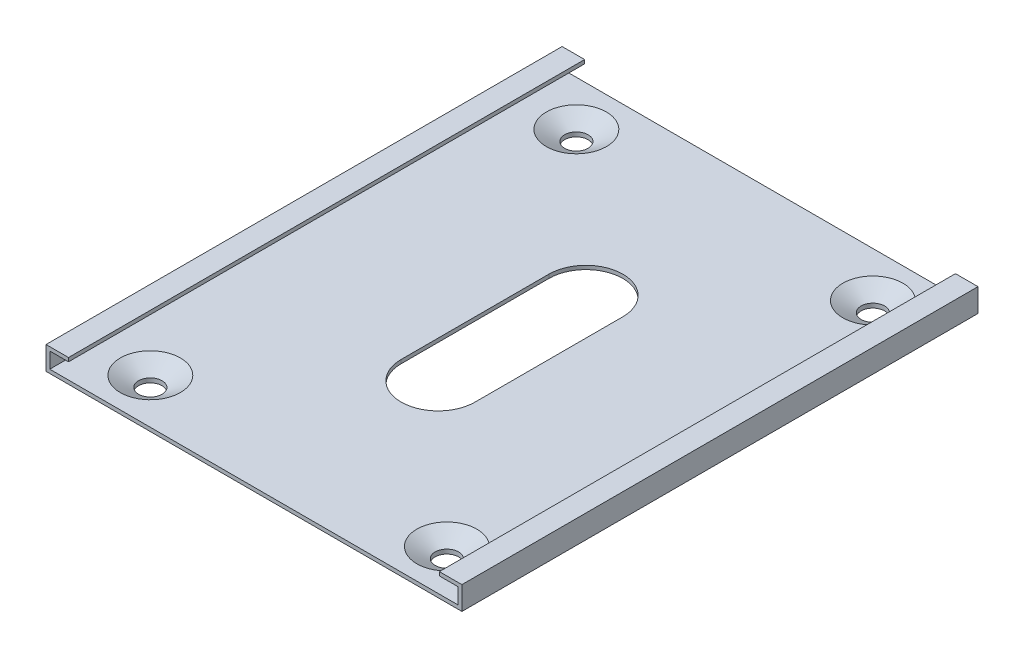
ISO-10303-21;
HEADER;
FILE_DESCRIPTION(('STEP AP214'),'2;1');
FILE_NAME('part.step','',(''),(''),'','','');
FILE_SCHEMA(('AUTOMOTIVE_DESIGN { 1 0 10303 214 1 1 1 1 }'));
ENDSEC;
DATA;
#1=APPLICATION_CONTEXT('core data for automotive mechanical design processes');
#2=APPLICATION_PROTOCOL_DEFINITION('international standard','automotive_design',2000,#1);
#3=PRODUCT_CONTEXT('',#1,'mechanical');
#4=PRODUCT('Part','Part','',(#3));
#5=PRODUCT_RELATED_PRODUCT_CATEGORY('part','',(#4));
#6=PRODUCT_DEFINITION_FORMATION('','',#4);
#7=PRODUCT_DEFINITION_CONTEXT('part definition',#1,'design');
#8=PRODUCT_DEFINITION('design','',#6,#7);
#9=PRODUCT_DEFINITION_SHAPE('','',#8);
#10=(LENGTH_UNIT() NAMED_UNIT(*) SI_UNIT(.MILLI.,.METRE.));
#11=(NAMED_UNIT(*) PLANE_ANGLE_UNIT() SI_UNIT($,.RADIAN.));
#12=(NAMED_UNIT(*) SI_UNIT($,.STERADIAN.) SOLID_ANGLE_UNIT());
#13=UNCERTAINTY_MEASURE_WITH_UNIT(LENGTH_MEASURE(1.E-05),#10,'distance_accuracy_value','');
#14=(GEOMETRIC_REPRESENTATION_CONTEXT(3) GLOBAL_UNCERTAINTY_ASSIGNED_CONTEXT((#13)) GLOBAL_UNIT_ASSIGNED_CONTEXT((#10,
#11,#12)) REPRESENTATION_CONTEXT('',''));
#15=CARTESIAN_POINT('',(0.,0.,0.));
#16=DIRECTION('',(0.,0.,1.));
#17=DIRECTION('',(1.,0.,0.));
#18=AXIS2_PLACEMENT_3D('',#15,#16,#17);
#19=CARTESIAN_POINT('',(-27.6352,2.13359999999999,69.85));
#20=DIRECTION('',(0.,1.,0.));
#21=DIRECTION('',(0.,0.,1.));
#22=AXIS2_PLACEMENT_3D('',#19,#20,#21);
#23=PLANE('',#22);
#24=DIRECTION('',(1.,0.,0.));
#25=VECTOR('',#24,1.);
#26=CARTESIAN_POINT('',(-27.6352,2.13359999999999,0.));
#27=LINE('',#26,#25);
#28=CARTESIAN_POINT('',(-27.6352,2.13359999999999,0.));
#29=VERTEX_POINT('',#28);
#30=CARTESIAN_POINT('',(-25.0952,2.13359999999999,0.));
#31=VERTEX_POINT('',#30);
#32=EDGE_CURVE('E171',#29,#31,#27,.T.);
#33=ORIENTED_EDGE('',*,*,#32,.T.);
#34=DIRECTION('',(0.,0.,-1.));
#35=VECTOR('',#34,1.);
#36=CARTESIAN_POINT('',(-25.0952,2.13359999999999,69.85));
#37=LINE('',#36,#35);
#38=CARTESIAN_POINT('',(-25.0952,2.13359999999999,69.85));
#39=VERTEX_POINT('',#38);
#40=EDGE_CURVE('E228',#39,#31,#37,.T.);
#41=ORIENTED_EDGE('',*,*,#40,.F.);
#42=DIRECTION('',(1.,0.,0.));
#43=VECTOR('',#42,1.);
#44=CARTESIAN_POINT('',(-27.6352,2.13359999999999,69.85));
#45=LINE('',#44,#43);
#46=CARTESIAN_POINT('',(-27.6352,2.13359999999999,69.85));
#47=VERTEX_POINT('',#46);
#48=EDGE_CURVE('E166',#47,#39,#45,.T.);
#49=ORIENTED_EDGE('',*,*,#48,.F.);
#50=DIRECTION('',(0.,0.,-1.));
#51=VECTOR('',#50,1.);
#52=CARTESIAN_POINT('',(-27.6352,2.13359999999999,69.85));
#53=LINE('',#52,#51);
#54=EDGE_CURVE('E161',#47,#29,#53,.T.);
#55=ORIENTED_EDGE('',*,*,#54,.T.);
#56=EDGE_LOOP('',(#33,#41,#49,#55));
#57=FACE_BOUND('',#56,.T.);
#58=ADVANCED_FACE('F32',(#57),#23,.F.);
#59=CARTESIAN_POINT('',(-25.0952,2.64159999999999,69.85));
#60=DIRECTION('',(1.,0.,0.));
#61=DIRECTION('',(0.,0.,-1.));
#62=AXIS2_PLACEMENT_3D('',#59,#60,#61);
#63=PLANE('',#62);
#64=DIRECTION('',(0.,-1.,0.));
#65=VECTOR('',#64,1.);
#66=CARTESIAN_POINT('',(-25.0952,2.64159999999999,0.));
#67=LINE('',#66,#65);
#68=CARTESIAN_POINT('',(-25.0952,2.64159999999999,0.));
#69=VERTEX_POINT('',#68);
#70=EDGE_CURVE('E178',#69,#31,#67,.T.);
#71=ORIENTED_EDGE('',*,*,#70,.F.);
#72=DIRECTION('',(0.,0.,-1.));
#73=VECTOR('',#72,1.);
#74=CARTESIAN_POINT('',(-25.0952,2.64159999999999,69.85));
#75=LINE('',#74,#73);
#76=CARTESIAN_POINT('',(-25.0952,2.64159999999999,69.85));
#77=VERTEX_POINT('',#76);
#78=EDGE_CURVE('E226',#77,#69,#75,.T.);
#79=ORIENTED_EDGE('',*,*,#78,.F.);
#80=DIRECTION('',(0.,-1.,0.));
#81=VECTOR('',#80,1.);
#82=CARTESIAN_POINT('',(-25.0952,2.64159999999999,69.85));
#83=LINE('',#82,#81);
#84=EDGE_CURVE('E289',#77,#39,#83,.T.);
#85=ORIENTED_EDGE('',*,*,#84,.T.);
#86=ORIENTED_EDGE('',*,*,#40,.T.);
#87=EDGE_LOOP('',(#71,#79,#85,#86));
#88=FACE_BOUND('',#87,.T.);
#89=ADVANCED_FACE('F320',(#88),#63,.T.);
#90=CARTESIAN_POINT('',(-27.6352,2.64159999999999,69.85));
#91=DIRECTION('',(0.,1.,0.));
#92=DIRECTION('',(0.,0.,1.));
#93=AXIS2_PLACEMENT_3D('',#90,#91,#92);
#94=PLANE('',#93);
#95=DIRECTION('',(1.,0.,0.));
#96=VECTOR('',#95,1.);
#97=CARTESIAN_POINT('',(-27.6352,2.64159999999999,0.));
#98=LINE('',#97,#96);
#99=CARTESIAN_POINT('',(-28.1432,2.64159999999999,0.));
#100=VERTEX_POINT('',#99);
#101=EDGE_CURVE('E181',#100,#69,#98,.T.);
#102=ORIENTED_EDGE('',*,*,#101,.F.);
#103=DIRECTION('',(0.,0.,-1.));
#104=VECTOR('',#103,1.);
#105=CARTESIAN_POINT('',(-28.1432,2.64159999999999,69.85));
#106=LINE('',#105,#104);
#107=CARTESIAN_POINT('',(-28.1432,2.64159999999999,69.85));
#108=VERTEX_POINT('',#107);
#109=EDGE_CURVE('E224',#108,#100,#106,.T.);
#110=ORIENTED_EDGE('',*,*,#109,.F.);
#111=DIRECTION('',(1.,0.,0.));
#112=VECTOR('',#111,1.);
#113=CARTESIAN_POINT('',(-27.6352,2.64159999999999,69.85));
#114=LINE('',#113,#112);
#115=EDGE_CURVE('E292',#108,#77,#114,.T.);
#116=ORIENTED_EDGE('',*,*,#115,.T.);
#117=ORIENTED_EDGE('',*,*,#78,.T.);
#118=EDGE_LOOP('',(#102,#110,#116,#117));
#119=FACE_BOUND('',#118,.T.);
#120=ADVANCED_FACE('F323',(#119),#94,.T.);
#121=CARTESIAN_POINT('',(-28.1432,0.,69.85));
#122=DIRECTION('',(-1.,0.,0.));
#123=DIRECTION('',(0.,0.,1.));
#124=AXIS2_PLACEMENT_3D('',#121,#122,#123);
#125=PLANE('',#124);
#126=DIRECTION('',(0.,1.,0.));
#127=VECTOR('',#126,1.);
#128=CARTESIAN_POINT('',(-28.1432,0.,0.));
#129=LINE('',#128,#127);
#130=CARTESIAN_POINT('',(-28.1432,-0.508,0.));
#131=VERTEX_POINT('',#130);
#132=EDGE_CURVE('E188',#131,#100,#129,.T.);
#133=ORIENTED_EDGE('',*,*,#132,.F.);
#134=DIRECTION('',(0.,0.,-1.));
#135=VECTOR('',#134,1.);
#136=CARTESIAN_POINT('',(-28.1432,-0.508,69.85));
#137=LINE('',#136,#135);
#138=CARTESIAN_POINT('',(-28.1432,-0.508,69.85));
#139=VERTEX_POINT('',#138);
#140=EDGE_CURVE('E222',#139,#131,#137,.T.);
#141=ORIENTED_EDGE('',*,*,#140,.F.);
#142=DIRECTION('',(0.,1.,0.));
#143=VECTOR('',#142,1.);
#144=CARTESIAN_POINT('',(-28.1432,0.,69.85));
#145=LINE('',#144,#143);
#146=EDGE_CURVE('E295',#139,#108,#145,.T.);
#147=ORIENTED_EDGE('',*,*,#146,.T.);
#148=ORIENTED_EDGE('',*,*,#109,.T.);
#149=EDGE_LOOP('',(#133,#141,#147,#148));
#150=FACE_BOUND('',#149,.T.);
#151=ADVANCED_FACE('F328',(#150),#125,.T.);
#152=CARTESIAN_POINT('',(27.6352,-0.508,69.85));
#153=DIRECTION('',(0.,-1.,0.));
#154=DIRECTION('',(0.,0.,-1.));
#155=AXIS2_PLACEMENT_3D('',#152,#153,#154);
#156=PLANE('',#155);
#157=CARTESIAN_POINT('',(-20.1168,-0.508,6.096));
#158=DIRECTION('',(0.,-1.,0.));
#159=DIRECTION('',(0.,0.,-1.));
#160=AXIS2_PLACEMENT_3D('',#157,#158,#159);
#161=CIRCLE('',#160,4.20011818975501);
#162=CARTESIAN_POINT('',(-20.1168,-0.508,1.895881810245));
#163=VERTEX_POINT('',#162);
#164=EDGE_CURVE('E528',#163,#163,#161,.F.);
#165=ORIENTED_EDGE('',*,*,#164,.T.);
#166=EDGE_LOOP('',(#165));
#167=FACE_BOUND('',#166,.T.);
#168=CARTESIAN_POINT('',(20.0152,-0.508,6.096));
#169=DIRECTION('',(0.,-1.,0.));
#170=DIRECTION('',(0.,0.,-1.));
#171=AXIS2_PLACEMENT_3D('',#168,#169,#170);
#172=CIRCLE('',#171,4.20011818975501);
#173=CARTESIAN_POINT('',(20.0152,-0.508,1.895881810245));
#174=VERTEX_POINT('',#173);
#175=EDGE_CURVE('E245',#174,#174,#172,.F.);
#176=ORIENTED_EDGE('',*,*,#175,.T.);
#177=EDGE_LOOP('',(#176));
#178=FACE_BOUND('',#177,.T.);
#179=CARTESIAN_POINT('',(-20.1168,-0.508,63.754));
#180=DIRECTION('',(0.,-1.,0.));
#181=DIRECTION('',(0.,0.,-1.));
#182=AXIS2_PLACEMENT_3D('',#179,#180,#181);
#183=CIRCLE('',#182,4.20011818975501);
#184=CARTESIAN_POINT('',(-20.1168,-0.508,59.553881810245));
#185=VERTEX_POINT('',#184);
#186=EDGE_CURVE('E268',#185,#185,#183,.F.);
#187=ORIENTED_EDGE('',*,*,#186,.T.);
#188=EDGE_LOOP('',(#187));
#189=FACE_BOUND('',#188,.T.);
#190=CARTESIAN_POINT('',(20.0152,-0.508,63.754));
#191=DIRECTION('',(0.,-1.,0.));
#192=DIRECTION('',(0.,0.,-1.));
#193=AXIS2_PLACEMENT_3D('',#190,#191,#192);
#194=CIRCLE('',#193,4.20011818975501);
#195=CARTESIAN_POINT('',(20.0152,-0.508,59.553881810245));
#196=VERTEX_POINT('',#195);
#197=EDGE_CURVE('E280',#196,#196,#194,.F.);
#198=ORIENTED_EDGE('',*,*,#197,.T.);
#199=EDGE_LOOP('',(#198));
#200=FACE_BOUND('',#199,.T.);
#201=CARTESIAN_POINT('',(0.,-0.508,44.925));
#202=DIRECTION('',(0.,-1.,0.));
#203=DIRECTION('',(0.,0.,-1.));
#204=AXIS2_PLACEMENT_3D('',#201,#202,#203);
#205=CIRCLE('',#204,5.);
#206=CARTESIAN_POINT('',(4.99999999999999,-0.508,44.925));
#207=VERTEX_POINT('',#206);
#208=CARTESIAN_POINT('',(-5.00000000000001,-0.508,44.925));
#209=VERTEX_POINT('',#208);
#210=EDGE_CURVE('E179',#207,#209,#205,.T.);
#211=ORIENTED_EDGE('',*,*,#210,.F.);
#212=DIRECTION('',(0.,0.,-1.));
#213=VECTOR('',#212,1.);
#214=CARTESIAN_POINT('',(4.99999999999999,-0.508,44.925));
#215=LINE('',#214,#213);
#216=CARTESIAN_POINT('',(5.00000000000002,-0.508,24.925));
#217=VERTEX_POINT('',#216);
#218=EDGE_CURVE('E77',#217,#207,#215,.F.);
#219=ORIENTED_EDGE('',*,*,#218,.F.);
#220=CARTESIAN_POINT('',(0.,-0.508,24.925));
#221=DIRECTION('',(0.,-1.,0.));
#222=DIRECTION('',(0.,0.,-1.));
#223=AXIS2_PLACEMENT_3D('',#220,#221,#222);
#224=CIRCLE('',#223,5.);
#225=CARTESIAN_POINT('',(-4.99999999999999,-0.508,24.925));
#226=VERTEX_POINT('',#225);
#227=EDGE_CURVE('E240',#226,#217,#224,.T.);
#228=ORIENTED_EDGE('',*,*,#227,.F.);
#229=DIRECTION('',(0.,0.,1.));
#230=VECTOR('',#229,1.);
#231=CARTESIAN_POINT('',(-5.00000000000001,-0.508,44.925));
#232=LINE('',#231,#230);
#233=EDGE_CURVE('E238',#209,#226,#232,.F.);
#234=ORIENTED_EDGE('',*,*,#233,.F.);
#235=EDGE_LOOP('',(#211,#219,#228,#234));
#236=FACE_BOUND('',#235,.T.);
#237=DIRECTION('',(1.,0.,0.));
#238=VECTOR('',#237,1.);
#239=CARTESIAN_POINT('',(27.6352,-0.508,0.));
#240=LINE('',#239,#238);
#241=CARTESIAN_POINT('',(28.1432,-0.508,0.));
#242=VERTEX_POINT('',#241);
#243=EDGE_CURVE('E191',#242,#131,#240,.F.);
#244=ORIENTED_EDGE('',*,*,#243,.F.);
#245=DIRECTION('',(0.,0.,-1.));
#246=VECTOR('',#245,1.);
#247=CARTESIAN_POINT('',(28.1432,-0.508,69.85));
#248=LINE('',#247,#246);
#249=CARTESIAN_POINT('',(28.1432,-0.508,69.85));
#250=VERTEX_POINT('',#249);
#251=EDGE_CURVE('E220',#250,#242,#248,.T.);
#252=ORIENTED_EDGE('',*,*,#251,.F.);
#253=DIRECTION('',(1.,0.,0.));
#254=VECTOR('',#253,1.);
#255=CARTESIAN_POINT('',(27.6352,-0.508,69.85));
#256=LINE('',#255,#254);
#257=EDGE_CURVE('E298',#250,#139,#256,.F.);
#258=ORIENTED_EDGE('',*,*,#257,.T.);
#259=ORIENTED_EDGE('',*,*,#140,.T.);
#260=EDGE_LOOP('',(#244,#252,#258,#259));
#261=FACE_BOUND('',#260,.T.);
#262=ADVANCED_FACE('F331',(#167,#178,#189,#200,#236,#261),#156,.T.);
#263=CARTESIAN_POINT('',(28.1432,0.,69.85));
#264=DIRECTION('',(1.,0.,0.));
#265=DIRECTION('',(0.,0.,-1.));
#266=AXIS2_PLACEMENT_3D('',#263,#264,#265);
#267=PLANE('',#266);
#268=DIRECTION('',(0.,1.,0.));
#269=VECTOR('',#268,1.);
#270=CARTESIAN_POINT('',(28.1432,0.,0.));
#271=LINE('',#270,#269);
#272=CARTESIAN_POINT('',(28.1432,2.64159999999999,0.));
#273=VERTEX_POINT('',#272);
#274=EDGE_CURVE('E194',#273,#242,#271,.F.);
#275=ORIENTED_EDGE('',*,*,#274,.F.);
#276=DIRECTION('',(0.,0.,-1.));
#277=VECTOR('',#276,1.);
#278=CARTESIAN_POINT('',(28.1432,2.64159999999999,69.85));
#279=LINE('',#278,#277);
#280=CARTESIAN_POINT('',(28.1432,2.64159999999999,69.85));
#281=VERTEX_POINT('',#280);
#282=EDGE_CURVE('E218',#281,#273,#279,.T.);
#283=ORIENTED_EDGE('',*,*,#282,.F.);
#284=DIRECTION('',(0.,1.,0.));
#285=VECTOR('',#284,1.);
#286=CARTESIAN_POINT('',(28.1432,0.,69.85));
#287=LINE('',#286,#285);
#288=EDGE_CURVE('E301',#281,#250,#287,.F.);
#289=ORIENTED_EDGE('',*,*,#288,.T.);
#290=ORIENTED_EDGE('',*,*,#251,.T.);
#291=EDGE_LOOP('',(#275,#283,#289,#290));
#292=FACE_BOUND('',#291,.T.);
#293=ADVANCED_FACE('F336',(#292),#267,.T.);
#294=CARTESIAN_POINT('',(27.6352,2.64159999999999,69.85));
#295=DIRECTION('',(0.,1.,0.));
#296=DIRECTION('',(0.,0.,1.));
#297=AXIS2_PLACEMENT_3D('',#294,#295,#296);
#298=PLANE('',#297);
#299=DIRECTION('',(1.,0.,0.));
#300=VECTOR('',#299,1.);
#301=CARTESIAN_POINT('',(27.6352,2.64159999999999,0.));
#302=LINE('',#301,#300);
#303=CARTESIAN_POINT('',(25.0952,2.64159999999999,0.));
#304=VERTEX_POINT('',#303);
#305=EDGE_CURVE('E197',#304,#273,#302,.T.);
#306=ORIENTED_EDGE('',*,*,#305,.F.);
#307=DIRECTION('',(0.,0.,-1.));
#308=VECTOR('',#307,1.);
#309=CARTESIAN_POINT('',(25.0952,2.64159999999999,69.85));
#310=LINE('',#309,#308);
#311=CARTESIAN_POINT('',(25.0952,2.64159999999999,69.85));
#312=VERTEX_POINT('',#311);
#313=EDGE_CURVE('E216',#312,#304,#310,.T.);
#314=ORIENTED_EDGE('',*,*,#313,.F.);
#315=DIRECTION('',(1.,0.,0.));
#316=VECTOR('',#315,1.);
#317=CARTESIAN_POINT('',(27.6352,2.64159999999999,69.85));
#318=LINE('',#317,#316);
#319=EDGE_CURVE('E304',#312,#281,#318,.T.);
#320=ORIENTED_EDGE('',*,*,#319,.T.);
#321=ORIENTED_EDGE('',*,*,#282,.T.);
#322=EDGE_LOOP('',(#306,#314,#320,#321));
#323=FACE_BOUND('',#322,.T.);
#324=ADVANCED_FACE('F339',(#323),#298,.T.);
#325=CARTESIAN_POINT('',(25.0952,2.13359999999999,69.85));
#326=DIRECTION('',(-1.,0.,0.));
#327=DIRECTION('',(0.,0.,1.));
#328=AXIS2_PLACEMENT_3D('',#325,#326,#327);
#329=PLANE('',#328);
#330=DIRECTION('',(0.,1.,0.));
#331=VECTOR('',#330,1.);
#332=CARTESIAN_POINT('',(25.0952,2.13359999999999,0.));
#333=LINE('',#332,#331);
#334=CARTESIAN_POINT('',(25.0952,2.13359999999999,0.));
#335=VERTEX_POINT('',#334);
#336=EDGE_CURVE('E200',#335,#304,#333,.T.);
#337=ORIENTED_EDGE('',*,*,#336,.F.);
#338=DIRECTION('',(0.,0.,-1.));
#339=VECTOR('',#338,1.);
#340=CARTESIAN_POINT('',(25.0952,2.13359999999999,69.85));
#341=LINE('',#340,#339);
#342=CARTESIAN_POINT('',(25.0952,2.13359999999999,69.85));
#343=VERTEX_POINT('',#342);
#344=EDGE_CURVE('E214',#343,#335,#341,.T.);
#345=ORIENTED_EDGE('',*,*,#344,.F.);
#346=DIRECTION('',(0.,1.,0.));
#347=VECTOR('',#346,1.);
#348=CARTESIAN_POINT('',(25.0952,2.13359999999999,69.85));
#349=LINE('',#348,#347);
#350=EDGE_CURVE('E307',#343,#312,#349,.T.);
#351=ORIENTED_EDGE('',*,*,#350,.T.);
#352=ORIENTED_EDGE('',*,*,#313,.T.);
#353=EDGE_LOOP('',(#337,#345,#351,#352));
#354=FACE_BOUND('',#353,.T.);
#355=ADVANCED_FACE('F343',(#354),#329,.T.);
#356=CARTESIAN_POINT('',(27.6352,2.13359999999999,69.85));
#357=DIRECTION('',(0.,1.,0.));
#358=DIRECTION('',(0.,0.,1.));
#359=AXIS2_PLACEMENT_3D('',#356,#357,#358);
#360=PLANE('',#359);
#361=DIRECTION('',(1.,0.,0.));
#362=VECTOR('',#361,1.);
#363=CARTESIAN_POINT('',(27.6352,2.13359999999999,0.));
#364=LINE('',#363,#362);
#365=CARTESIAN_POINT('',(27.6352,2.13359999999999,0.));
#366=VERTEX_POINT('',#365);
#367=EDGE_CURVE('E203',#335,#366,#364,.T.);
#368=ORIENTED_EDGE('',*,*,#367,.T.);
#369=DIRECTION('',(0.,0.,-1.));
#370=VECTOR('',#369,1.);
#371=CARTESIAN_POINT('',(27.6352,2.13359999999999,69.85));
#372=LINE('',#371,#370);
#373=CARTESIAN_POINT('',(27.6352,2.13359999999999,69.85));
#374=VERTEX_POINT('',#373);
#375=EDGE_CURVE('E211',#374,#366,#372,.T.);
#376=ORIENTED_EDGE('',*,*,#375,.F.);
#377=DIRECTION('',(1.,0.,0.));
#378=VECTOR('',#377,1.);
#379=CARTESIAN_POINT('',(27.6352,2.13359999999999,69.85));
#380=LINE('',#379,#378);
#381=EDGE_CURVE('E310',#343,#374,#380,.T.);
#382=ORIENTED_EDGE('',*,*,#381,.F.);
#383=ORIENTED_EDGE('',*,*,#344,.T.);
#384=EDGE_LOOP('',(#368,#376,#382,#383));
#385=FACE_BOUND('',#384,.T.);
#386=ADVANCED_FACE('F348',(#385),#360,.F.);
#387=CARTESIAN_POINT('',(27.6352,0.,69.85));
#388=DIRECTION('',(1.,0.,0.));
#389=DIRECTION('',(0.,0.,-1.));
#390=AXIS2_PLACEMENT_3D('',#387,#388,#389);
#391=PLANE('',#390);
#392=DIRECTION('',(0.,-1.,0.));
#393=VECTOR('',#392,1.);
#394=CARTESIAN_POINT('',(27.6352,0.,0.));
#395=LINE('',#394,#393);
#396=CARTESIAN_POINT('',(27.6352,0.,0.));
#397=VERTEX_POINT('',#396);
#398=EDGE_CURVE('E205',#366,#397,#395,.T.);
#399=ORIENTED_EDGE('',*,*,#398,.T.);
#400=DIRECTION('',(0.,0.,-1.));
#401=VECTOR('',#400,1.);
#402=CARTESIAN_POINT('',(27.6352,0.,69.85));
#403=LINE('',#402,#401);
#404=CARTESIAN_POINT('',(27.6352,0.,69.85));
#405=VERTEX_POINT('',#404);
#406=EDGE_CURVE('E209',#405,#397,#403,.T.);
#407=ORIENTED_EDGE('',*,*,#406,.F.);
#408=DIRECTION('',(0.,-1.,0.));
#409=VECTOR('',#408,1.);
#410=CARTESIAN_POINT('',(27.6352,0.,69.85));
#411=LINE('',#410,#409);
#412=EDGE_CURVE('E312',#374,#405,#411,.T.);
#413=ORIENTED_EDGE('',*,*,#412,.F.);
#414=ORIENTED_EDGE('',*,*,#375,.T.);
#415=EDGE_LOOP('',(#399,#407,#413,#414));
#416=FACE_BOUND('',#415,.T.);
#417=ADVANCED_FACE('F352',(#416),#391,.F.);
#418=CARTESIAN_POINT('',(27.6352,0.,69.85));
#419=DIRECTION('',(0.,-1.,0.));
#420=DIRECTION('',(0.,0.,-1.));
#421=AXIS2_PLACEMENT_3D('',#418,#419,#420);
#422=PLANE('',#421);
#423=DIRECTION('',(0.,0.,1.));
#424=VECTOR('',#423,1.);
#425=CARTESIAN_POINT('',(4.99999999999997,0.,69.85));
#426=LINE('',#425,#424);
#427=CARTESIAN_POINT('',(5.00000000000002,0.,24.925));
#428=VERTEX_POINT('',#427);
#429=CARTESIAN_POINT('',(4.99999999999999,0.,44.925));
#430=VERTEX_POINT('',#429);
#431=EDGE_CURVE('E40',#428,#430,#426,.T.);
#432=ORIENTED_EDGE('',*,*,#431,.T.);
#433=CARTESIAN_POINT('',(0.,0.,44.925));
#434=DIRECTION('',(0.,-1.,0.));
#435=DIRECTION('',(0.,0.,-1.));
#436=AXIS2_PLACEMENT_3D('',#433,#434,#435);
#437=CIRCLE('',#436,5.);
#438=CARTESIAN_POINT('',(-5.00000000000001,0.,44.925));
#439=VERTEX_POINT('',#438);
#440=EDGE_CURVE('E11',#430,#439,#437,.T.);
#441=ORIENTED_EDGE('',*,*,#440,.T.);
#442=DIRECTION('',(0.,0.,-1.));
#443=VECTOR('',#442,1.);
#444=CARTESIAN_POINT('',(-5.00000000000004,0.,69.85));
#445=LINE('',#444,#443);
#446=CARTESIAN_POINT('',(-4.99999999999999,0.,24.925));
#447=VERTEX_POINT('',#446);
#448=EDGE_CURVE('E230',#439,#447,#445,.T.);
#449=ORIENTED_EDGE('',*,*,#448,.T.);
#450=CARTESIAN_POINT('',(0.,0.,24.925));
#451=DIRECTION('',(0.,-1.,0.));
#452=DIRECTION('',(0.,0.,-1.));
#453=AXIS2_PLACEMENT_3D('',#450,#451,#452);
#454=CIRCLE('',#453,5.);
#455=EDGE_CURVE('E233',#447,#428,#454,.T.);
#456=ORIENTED_EDGE('',*,*,#455,.T.);
#457=EDGE_LOOP('',(#432,#441,#449,#456));
#458=FACE_BOUND('',#457,.T.);
#459=DIRECTION('',(-1.,0.,0.));
#460=VECTOR('',#459,1.);
#461=CARTESIAN_POINT('',(27.6352,0.,0.));
#462=LINE('',#461,#460);
#463=CARTESIAN_POINT('',(-27.6352,0.,0.));
#464=VERTEX_POINT('',#463);
#465=EDGE_CURVE('E151',#397,#464,#462,.T.);
#466=ORIENTED_EDGE('',*,*,#465,.T.);
#467=DIRECTION('',(0.,0.,-1.));
#468=VECTOR('',#467,1.);
#469=CARTESIAN_POINT('',(-27.6352,0.,69.85));
#470=LINE('',#469,#468);
#471=CARTESIAN_POINT('',(-27.6352,0.,69.85));
#472=VERTEX_POINT('',#471);
#473=EDGE_CURVE('E163',#472,#464,#470,.T.);
#474=ORIENTED_EDGE('',*,*,#473,.F.);
#475=DIRECTION('',(-1.,0.,0.));
#476=VECTOR('',#475,1.);
#477=CARTESIAN_POINT('',(27.6352,0.,69.85));
#478=LINE('',#477,#476);
#479=EDGE_CURVE('E313',#405,#472,#478,.T.);
#480=ORIENTED_EDGE('',*,*,#479,.F.);
#481=ORIENTED_EDGE('',*,*,#406,.T.);
#482=EDGE_LOOP('',(#466,#474,#480,#481));
#483=FACE_BOUND('',#482,.T.);
#484=CARTESIAN_POINT('',(20.0152,0.,63.754));
#485=DIRECTION('',(0.,1.,0.));
#486=DIRECTION('',(0.,0.,1.));
#487=AXIS2_PLACEMENT_3D('',#484,#485,#486);
#488=CIRCLE('',#487,4.064);
#489=CARTESIAN_POINT('',(20.0152,0.,67.818));
#490=VERTEX_POINT('',#489);
#491=EDGE_CURVE('E277',#490,#490,#488,.T.);
#492=ORIENTED_EDGE('',*,*,#491,.F.);
#493=EDGE_LOOP('',(#492));
#494=FACE_BOUND('',#493,.T.);
#495=CARTESIAN_POINT('',(-20.1168,0.,63.754));
#496=DIRECTION('',(0.,1.,0.));
#497=DIRECTION('',(0.,0.,1.));
#498=AXIS2_PLACEMENT_3D('',#495,#496,#497);
#499=CIRCLE('',#498,4.064);
#500=CARTESIAN_POINT('',(-20.1168,0.,67.818));
#501=VERTEX_POINT('',#500);
#502=EDGE_CURVE('E265',#501,#501,#499,.T.);
#503=ORIENTED_EDGE('',*,*,#502,.F.);
#504=EDGE_LOOP('',(#503));
#505=FACE_BOUND('',#504,.T.);
#506=CARTESIAN_POINT('',(20.0152,0.,6.096));
#507=DIRECTION('',(0.,-1.,0.));
#508=DIRECTION('',(0.,0.,-1.));
#509=AXIS2_PLACEMENT_3D('',#506,#507,#508);
#510=CIRCLE('',#509,4.064);
#511=CARTESIAN_POINT('',(20.0152,0.,2.03200000000001));
#512=VERTEX_POINT('',#511);
#513=EDGE_CURVE('E35',#512,#512,#510,.F.);
#514=ORIENTED_EDGE('',*,*,#513,.F.);
#515=EDGE_LOOP('',(#514));
#516=FACE_BOUND('',#515,.T.);
#517=CARTESIAN_POINT('',(-20.1168,0.,6.096));
#518=DIRECTION('',(0.,-1.,0.));
#519=DIRECTION('',(0.,0.,-1.));
#520=AXIS2_PLACEMENT_3D('',#517,#518,#519);
#521=CIRCLE('',#520,4.064);
#522=CARTESIAN_POINT('',(-20.1168,0.,2.03200000000001));
#523=VERTEX_POINT('',#522);
#524=EDGE_CURVE('E243',#523,#523,#521,.F.);
#525=ORIENTED_EDGE('',*,*,#524,.F.);
#526=EDGE_LOOP('',(#525));
#527=FACE_BOUND('',#526,.T.);
#528=ADVANCED_FACE('F354',(#458,#483,#494,#505,#516,#527),#422,.F.);
#529=CARTESIAN_POINT('',(-27.6352,0.,69.85));
#530=DIRECTION('',(-1.,0.,0.));
#531=DIRECTION('',(0.,0.,1.));
#532=AXIS2_PLACEMENT_3D('',#529,#530,#531);
#533=PLANE('',#532);
#534=DIRECTION('',(0.,1.,0.));
#535=VECTOR('',#534,1.);
#536=CARTESIAN_POINT('',(-27.6352,0.,0.));
#537=LINE('',#536,#535);
#538=EDGE_CURVE('E157',#464,#29,#537,.T.);
#539=ORIENTED_EDGE('',*,*,#538,.T.);
#540=ORIENTED_EDGE('',*,*,#54,.F.);
#541=DIRECTION('',(0.,1.,0.));
#542=VECTOR('',#541,1.);
#543=CARTESIAN_POINT('',(-27.6352,0.,69.85));
#544=LINE('',#543,#542);
#545=EDGE_CURVE('E173',#472,#47,#544,.T.);
#546=ORIENTED_EDGE('',*,*,#545,.F.);
#547=ORIENTED_EDGE('',*,*,#473,.T.);
#548=EDGE_LOOP('',(#539,#540,#546,#547));
#549=FACE_BOUND('',#548,.T.);
#550=ADVANCED_FACE('F159',(#549),#533,.F.);
#551=CARTESIAN_POINT('',(0.,0.,69.85));
#552=DIRECTION('',(0.,0.,-1.));
#553=DIRECTION('',(-1.,0.,0.));
#554=AXIS2_PLACEMENT_3D('',#551,#552,#553);
#555=PLANE('',#554);
#556=ORIENTED_EDGE('',*,*,#48,.T.);
#557=ORIENTED_EDGE('',*,*,#84,.F.);
#558=ORIENTED_EDGE('',*,*,#115,.F.);
#559=ORIENTED_EDGE('',*,*,#146,.F.);
#560=ORIENTED_EDGE('',*,*,#257,.F.);
#561=ORIENTED_EDGE('',*,*,#288,.F.);
#562=ORIENTED_EDGE('',*,*,#319,.F.);
#563=ORIENTED_EDGE('',*,*,#350,.F.);
#564=ORIENTED_EDGE('',*,*,#381,.T.);
#565=ORIENTED_EDGE('',*,*,#412,.T.);
#566=ORIENTED_EDGE('',*,*,#479,.T.);
#567=ORIENTED_EDGE('',*,*,#545,.T.);
#568=EDGE_LOOP('',(#556,#557,#558,#559,#560,#561,#562,#563,#564,#565,#566,#567));
#569=FACE_BOUND('',#568,.T.);
#570=ADVANCED_FACE('F316',(#569),#555,.F.);
#571=CARTESIAN_POINT('',(0.,0.,0.));
#572=DIRECTION('',(0.,0.,-1.));
#573=DIRECTION('',(-1.,0.,0.));
#574=AXIS2_PLACEMENT_3D('',#571,#572,#573);
#575=PLANE('',#574);
#576=ORIENTED_EDGE('',*,*,#32,.F.);
#577=ORIENTED_EDGE('',*,*,#538,.F.);
#578=ORIENTED_EDGE('',*,*,#465,.F.);
#579=ORIENTED_EDGE('',*,*,#398,.F.);
#580=ORIENTED_EDGE('',*,*,#367,.F.);
#581=ORIENTED_EDGE('',*,*,#336,.T.);
#582=ORIENTED_EDGE('',*,*,#305,.T.);
#583=ORIENTED_EDGE('',*,*,#274,.T.);
#584=ORIENTED_EDGE('',*,*,#243,.T.);
#585=ORIENTED_EDGE('',*,*,#132,.T.);
#586=ORIENTED_EDGE('',*,*,#101,.T.);
#587=ORIENTED_EDGE('',*,*,#70,.T.);
#588=EDGE_LOOP('',(#576,#577,#578,#579,#580,#581,#582,#583,#584,#585,#586,#587));
#589=FACE_BOUND('',#588,.T.);
#590=ADVANCED_FACE('F175',(#589),#575,.T.);
#591=CARTESIAN_POINT('',(0.,2.64159999999999,44.925));
#592=DIRECTION('',(0.,-1.,0.));
#593=DIRECTION('',(0.,0.,-1.));
#594=AXIS2_PLACEMENT_3D('',#591,#592,#593);
#595=CYLINDRICAL_SURFACE('',#594,5.);
#596=ORIENTED_EDGE('',*,*,#210,.T.);
#597=DIRECTION('',(0.,-1.,0.));
#598=VECTOR('',#597,1.);
#599=CARTESIAN_POINT('',(-5.00000000000001,2.64159999999999,44.925));
#600=LINE('',#599,#598);
#601=EDGE_CURVE('E48',#439,#209,#600,.T.);
#602=ORIENTED_EDGE('',*,*,#601,.F.);
#603=ORIENTED_EDGE('',*,*,#440,.F.);
#604=DIRECTION('',(0.,-1.,0.));
#605=VECTOR('',#604,1.);
#606=CARTESIAN_POINT('',(4.99999999999999,2.64159999999999,44.925));
#607=LINE('',#606,#605);
#608=EDGE_CURVE('E241',#430,#207,#607,.T.);
#609=ORIENTED_EDGE('',*,*,#608,.T.);
#610=EDGE_LOOP('',(#596,#602,#603,#609));
#611=FACE_BOUND('',#610,.T.);
#612=ADVANCED_FACE('F410',(#611),#595,.F.);
#613=CARTESIAN_POINT('',(4.99999999999999,2.64159999999999,44.925));
#614=DIRECTION('',(1.,0.,0.));
#615=DIRECTION('',(0.,0.,-1.));
#616=AXIS2_PLACEMENT_3D('',#613,#614,#615);
#617=PLANE('',#616);
#618=ORIENTED_EDGE('',*,*,#218,.T.);
#619=ORIENTED_EDGE('',*,*,#608,.F.);
#620=ORIENTED_EDGE('',*,*,#431,.F.);
#621=DIRECTION('',(0.,-1.,0.));
#622=VECTOR('',#621,1.);
#623=CARTESIAN_POINT('',(5.00000000000002,2.64159999999999,24.925));
#624=LINE('',#623,#622);
#625=EDGE_CURVE('E283',#428,#217,#624,.T.);
#626=ORIENTED_EDGE('',*,*,#625,.T.);
#627=EDGE_LOOP('',(#618,#619,#620,#626));
#628=FACE_BOUND('',#627,.T.);
#629=ADVANCED_FACE('F415',(#628),#617,.F.);
#630=CARTESIAN_POINT('',(0.,2.64159999999999,24.925));
#631=DIRECTION('',(0.,-1.,0.));
#632=DIRECTION('',(0.,0.,-1.));
#633=AXIS2_PLACEMENT_3D('',#630,#631,#632);
#634=CYLINDRICAL_SURFACE('',#633,5.);
#635=ORIENTED_EDGE('',*,*,#227,.T.);
#636=ORIENTED_EDGE('',*,*,#625,.F.);
#637=ORIENTED_EDGE('',*,*,#455,.F.);
#638=DIRECTION('',(0.,-1.,0.));
#639=VECTOR('',#638,1.);
#640=CARTESIAN_POINT('',(-4.99999999999999,2.64159999999999,24.925));
#641=LINE('',#640,#639);
#642=EDGE_CURVE('E54',#447,#226,#641,.T.);
#643=ORIENTED_EDGE('',*,*,#642,.T.);
#644=EDGE_LOOP('',(#635,#636,#637,#643));
#645=FACE_BOUND('',#644,.T.);
#646=ADVANCED_FACE('F420',(#645),#634,.F.);
#647=CARTESIAN_POINT('',(-5.00000000000001,2.64159999999999,44.925));
#648=DIRECTION('',(-1.,0.,0.));
#649=DIRECTION('',(0.,0.,1.));
#650=AXIS2_PLACEMENT_3D('',#647,#648,#649);
#651=PLANE('',#650);
#652=ORIENTED_EDGE('',*,*,#233,.T.);
#653=ORIENTED_EDGE('',*,*,#642,.F.);
#654=ORIENTED_EDGE('',*,*,#448,.F.);
#655=ORIENTED_EDGE('',*,*,#601,.T.);
#656=EDGE_LOOP('',(#652,#653,#654,#655));
#657=FACE_BOUND('',#656,.T.);
#658=ADVANCED_FACE('F416',(#657),#651,.F.);
#659=CARTESIAN_POINT('',(20.0152,0.,63.754));
#660=DIRECTION('',(0.,1.,0.));
#661=DIRECTION('',(0.,0.,1.));
#662=AXIS2_PLACEMENT_3D('',#659,#660,#661);
#663=CONICAL_SURFACE('',#662,4.064,1.0471975511966);
#664=CARTESIAN_POINT('',(20.0152,-1.4298079416481,63.754));
#665=DIRECTION('',(0.,1.,0.));
#666=DIRECTION('',(0.,0.,1.));
#667=AXIS2_PLACEMENT_3D('',#664,#665,#666);
#668=CIRCLE('',#667,1.5875);
#669=CARTESIAN_POINT('',(20.0152,-1.4298079416481,65.3415));
#670=VERTEX_POINT('',#669);
#671=EDGE_CURVE('E274',#670,#670,#668,.T.);
#672=ORIENTED_EDGE('',*,*,#671,.F.);
#673=EDGE_LOOP('',(#672));
#674=FACE_BOUND('',#673,.T.);
#675=ORIENTED_EDGE('',*,*,#491,.T.);
#676=EDGE_LOOP('',(#675));
#677=FACE_BOUND('',#676,.T.);
#678=ADVANCED_FACE('F419',(#674,#677),#663,.F.);
#679=CARTESIAN_POINT('',(20.0152,10.1098877683464,63.754));
#680=DIRECTION('',(0.,1.,0.));
#681=DIRECTION('',(0.,0.,1.));
#682=AXIS2_PLACEMENT_3D('',#679,#680,#681);
#683=CYLINDRICAL_SURFACE('',#682,1.5875);
#684=CARTESIAN_POINT('',(20.0152,-2.01639581514476,63.754));
#685=DIRECTION('',(0.,1.,0.));
#686=DIRECTION('',(0.,0.,1.));
#687=AXIS2_PLACEMENT_3D('',#684,#685,#686);
#688=CIRCLE('',#687,1.5875);
#689=CARTESIAN_POINT('',(20.0152,-2.01639581514476,65.3415));
#690=VERTEX_POINT('',#689);
#691=EDGE_CURVE('E271',#690,#690,#688,.T.);
#692=ORIENTED_EDGE('',*,*,#691,.F.);
#693=EDGE_LOOP('',(#692));
#694=FACE_BOUND('',#693,.T.);
#695=ORIENTED_EDGE('',*,*,#671,.T.);
#696=EDGE_LOOP('',(#695));
#697=FACE_BOUND('',#696,.T.);
#698=ADVANCED_FACE('F428',(#694,#697),#683,.F.);
#699=CARTESIAN_POINT('',(20.0152,-2.01639581514476,63.754));
#700=DIRECTION('',(0.,1.,0.));
#701=DIRECTION('',(0.,0.,1.));
#702=AXIS2_PLACEMENT_3D('',#699,#700,#701);
#703=CONICAL_SURFACE('',#702,1.5875,1.0471975511966);
#704=ORIENTED_EDGE('',*,*,#197,.F.);
#705=EDGE_LOOP('',(#704));
#706=FACE_BOUND('',#705,.T.);
#707=ORIENTED_EDGE('',*,*,#691,.T.);
#708=EDGE_LOOP('',(#707));
#709=FACE_BOUND('',#708,.T.);
#710=ADVANCED_FACE('F432',(#706,#709),#703,.T.);
#711=CARTESIAN_POINT('',(-20.1168,0.,63.754));
#712=DIRECTION('',(0.,1.,0.));
#713=DIRECTION('',(0.,0.,1.));
#714=AXIS2_PLACEMENT_3D('',#711,#712,#713);
#715=CONICAL_SURFACE('',#714,4.064,1.0471975511966);
#716=CARTESIAN_POINT('',(-20.1168,-1.4298079416481,63.754));
#717=DIRECTION('',(0.,1.,0.));
#718=DIRECTION('',(0.,0.,1.));
#719=AXIS2_PLACEMENT_3D('',#716,#717,#718);
#720=CIRCLE('',#719,1.5875);
#721=CARTESIAN_POINT('',(-20.1168,-1.4298079416481,65.3415));
#722=VERTEX_POINT('',#721);
#723=EDGE_CURVE('E262',#722,#722,#720,.T.);
#724=ORIENTED_EDGE('',*,*,#723,.F.);
#725=EDGE_LOOP('',(#724));
#726=FACE_BOUND('',#725,.T.);
#727=ORIENTED_EDGE('',*,*,#502,.T.);
#728=EDGE_LOOP('',(#727));
#729=FACE_BOUND('',#728,.T.);
#730=ADVANCED_FACE('F436',(#726,#729),#715,.F.);
#731=CARTESIAN_POINT('',(-20.1168,10.1098877683464,63.754));
#732=DIRECTION('',(0.,1.,0.));
#733=DIRECTION('',(0.,0.,1.));
#734=AXIS2_PLACEMENT_3D('',#731,#732,#733);
#735=CYLINDRICAL_SURFACE('',#734,1.5875);
#736=CARTESIAN_POINT('',(-20.1168,-2.01639581514476,63.754));
#737=DIRECTION('',(0.,1.,0.));
#738=DIRECTION('',(0.,0.,1.));
#739=AXIS2_PLACEMENT_3D('',#736,#737,#738);
#740=CIRCLE('',#739,1.5875);
#741=CARTESIAN_POINT('',(-20.1168,-2.01639581514476,65.3415));
#742=VERTEX_POINT('',#741);
#743=EDGE_CURVE('E249',#742,#742,#740,.T.);
#744=ORIENTED_EDGE('',*,*,#743,.F.);
#745=EDGE_LOOP('',(#744));
#746=FACE_BOUND('',#745,.T.);
#747=ORIENTED_EDGE('',*,*,#723,.T.);
#748=EDGE_LOOP('',(#747));
#749=FACE_BOUND('',#748,.T.);
#750=ADVANCED_FACE('F379',(#746,#749),#735,.F.);
#751=CARTESIAN_POINT('',(-20.1168,-2.01639581514476,63.754));
#752=DIRECTION('',(0.,1.,0.));
#753=DIRECTION('',(0.,0.,1.));
#754=AXIS2_PLACEMENT_3D('',#751,#752,#753);
#755=CONICAL_SURFACE('',#754,1.5875,1.0471975511966);
#756=ORIENTED_EDGE('',*,*,#186,.F.);
#757=EDGE_LOOP('',(#756));
#758=FACE_BOUND('',#757,.T.);
#759=ORIENTED_EDGE('',*,*,#743,.T.);
#760=EDGE_LOOP('',(#759));
#761=FACE_BOUND('',#760,.T.);
#762=ADVANCED_FACE('F369',(#758,#761),#755,.T.);
#763=CARTESIAN_POINT('',(20.0152,0.,6.096));
#764=DIRECTION('',(0.,1.,0.));
#765=DIRECTION('',(0.,0.,-1.));
#766=AXIS2_PLACEMENT_3D('',#763,#764,#765);
#767=CONICAL_SURFACE('',#766,4.064,1.0471975511966);
#768=CARTESIAN_POINT('',(20.0152,-1.4298079416481,6.096));
#769=DIRECTION('',(0.,-1.,0.));
#770=DIRECTION('',(0.,0.,-1.));
#771=AXIS2_PLACEMENT_3D('',#768,#769,#770);
#772=CIRCLE('',#771,1.5875);
#773=CARTESIAN_POINT('',(20.0152,-1.4298079416481,4.50850000000001));
#774=VERTEX_POINT('',#773);
#775=EDGE_CURVE('E251',#774,#774,#772,.T.);
#776=ORIENTED_EDGE('',*,*,#775,.T.);
#777=EDGE_LOOP('',(#776));
#778=FACE_BOUND('',#777,.T.);
#779=ORIENTED_EDGE('',*,*,#513,.T.);
#780=EDGE_LOOP('',(#779));
#781=FACE_BOUND('',#780,.T.);
#782=ADVANCED_FACE('F366',(#778,#781),#767,.F.);
#783=CARTESIAN_POINT('',(20.0152,10.1098877683464,6.096));
#784=DIRECTION('',(0.,1.,0.));
#785=DIRECTION('',(0.,0.,-1.));
#786=AXIS2_PLACEMENT_3D('',#783,#784,#785);
#787=CYLINDRICAL_SURFACE('',#786,1.5875);
#788=CARTESIAN_POINT('',(20.0152,-2.01639581514476,6.096));
#789=DIRECTION('',(0.,-1.,0.));
#790=DIRECTION('',(0.,0.,-1.));
#791=AXIS2_PLACEMENT_3D('',#788,#789,#790);
#792=CIRCLE('',#791,1.5875);
#793=CARTESIAN_POINT('',(20.0152,-2.01639581514476,4.50850000000001));
#794=VERTEX_POINT('',#793);
#795=EDGE_CURVE('E256',#794,#794,#792,.T.);
#796=ORIENTED_EDGE('',*,*,#795,.T.);
#797=EDGE_LOOP('',(#796));
#798=FACE_BOUND('',#797,.T.);
#799=ORIENTED_EDGE('',*,*,#775,.F.);
#800=EDGE_LOOP('',(#799));
#801=FACE_BOUND('',#800,.T.);
#802=ADVANCED_FACE('F368',(#798,#801),#787,.F.);
#803=CARTESIAN_POINT('',(20.0152,-2.01639581514476,6.096));
#804=DIRECTION('',(0.,1.,0.));
#805=DIRECTION('',(0.,0.,-1.));
#806=AXIS2_PLACEMENT_3D('',#803,#804,#805);
#807=CONICAL_SURFACE('',#806,1.5875,1.0471975511966);
#808=ORIENTED_EDGE('',*,*,#175,.F.);
#809=EDGE_LOOP('',(#808));
#810=FACE_BOUND('',#809,.T.);
#811=ORIENTED_EDGE('',*,*,#795,.F.);
#812=EDGE_LOOP('',(#811));
#813=FACE_BOUND('',#812,.T.);
#814=ADVANCED_FACE('F376',(#810,#813),#807,.T.);
#815=CARTESIAN_POINT('',(-20.1168,0.,6.096));
#816=DIRECTION('',(0.,1.,0.));
#817=DIRECTION('',(0.,0.,-1.));
#818=AXIS2_PLACEMENT_3D('',#815,#816,#817);
#819=CONICAL_SURFACE('',#818,4.064,1.0471975511966);
#820=CARTESIAN_POINT('',(-20.1168,-1.4298079416481,6.096));
#821=DIRECTION('',(0.,-1.,0.));
#822=DIRECTION('',(0.,0.,-1.));
#823=AXIS2_PLACEMENT_3D('',#820,#821,#822);
#824=CIRCLE('',#823,1.5875);
#825=CARTESIAN_POINT('',(-20.1168,-1.4298079416481,4.50850000000001));
#826=VERTEX_POINT('',#825);
#827=EDGE_CURVE('E532',#826,#826,#824,.T.);
#828=ORIENTED_EDGE('',*,*,#827,.T.);
#829=EDGE_LOOP('',(#828));
#830=FACE_BOUND('',#829,.T.);
#831=ORIENTED_EDGE('',*,*,#524,.T.);
#832=EDGE_LOOP('',(#831));
#833=FACE_BOUND('',#832,.T.);
#834=ADVANCED_FACE('F491',(#830,#833),#819,.F.);
#835=CARTESIAN_POINT('',(-20.1168,10.1098877683464,6.096));
#836=DIRECTION('',(0.,1.,0.));
#837=DIRECTION('',(0.,0.,-1.));
#838=AXIS2_PLACEMENT_3D('',#835,#836,#837);
#839=CYLINDRICAL_SURFACE('',#838,1.5875);
#840=CARTESIAN_POINT('',(-20.1168,-2.01639581514476,6.096));
#841=DIRECTION('',(0.,-1.,0.));
#842=DIRECTION('',(0.,0.,-1.));
#843=AXIS2_PLACEMENT_3D('',#840,#841,#842);
#844=CIRCLE('',#843,1.5875);
#845=CARTESIAN_POINT('',(-20.1168,-2.01639581514476,4.50850000000001));
#846=VERTEX_POINT('',#845);
#847=EDGE_CURVE('E531',#846,#846,#844,.T.);
#848=ORIENTED_EDGE('',*,*,#847,.T.);
#849=EDGE_LOOP('',(#848));
#850=FACE_BOUND('',#849,.T.);
#851=ORIENTED_EDGE('',*,*,#827,.F.);
#852=EDGE_LOOP('',(#851));
#853=FACE_BOUND('',#852,.T.);
#854=ADVANCED_FACE('F501',(#850,#853),#839,.F.);
#855=CARTESIAN_POINT('',(-20.1168,-2.01639581514476,6.096));
#856=DIRECTION('',(0.,1.,0.));
#857=DIRECTION('',(0.,0.,-1.));
#858=AXIS2_PLACEMENT_3D('',#855,#856,#857);
#859=CONICAL_SURFACE('',#858,1.5875,1.0471975511966);
#860=ORIENTED_EDGE('',*,*,#164,.F.);
#861=EDGE_LOOP('',(#860));
#862=FACE_BOUND('',#861,.T.);
#863=ORIENTED_EDGE('',*,*,#847,.F.);
#864=EDGE_LOOP('',(#863));
#865=FACE_BOUND('',#864,.T.);
#866=ADVANCED_FACE('F511',(#862,#865),#859,.T.);
#867=CLOSED_SHELL('',(#58,#89,#120,#151,#262,#293,#324,#355,#386,#417,#528,#550,#570,#590,#612,
#629,#646,#658,#678,#698,#710,#730,#750,#762,#782,#802,#814,#834,#854,#866));
#868=MANIFOLD_SOLID_BREP('B2',#867);
#869=ADVANCED_BREP_SHAPE_REPRESENTATION('',(#18,#868),#14);
#870=SHAPE_DEFINITION_REPRESENTATION(#9,#869);
ENDSEC;
END-ISO-10303-21;
